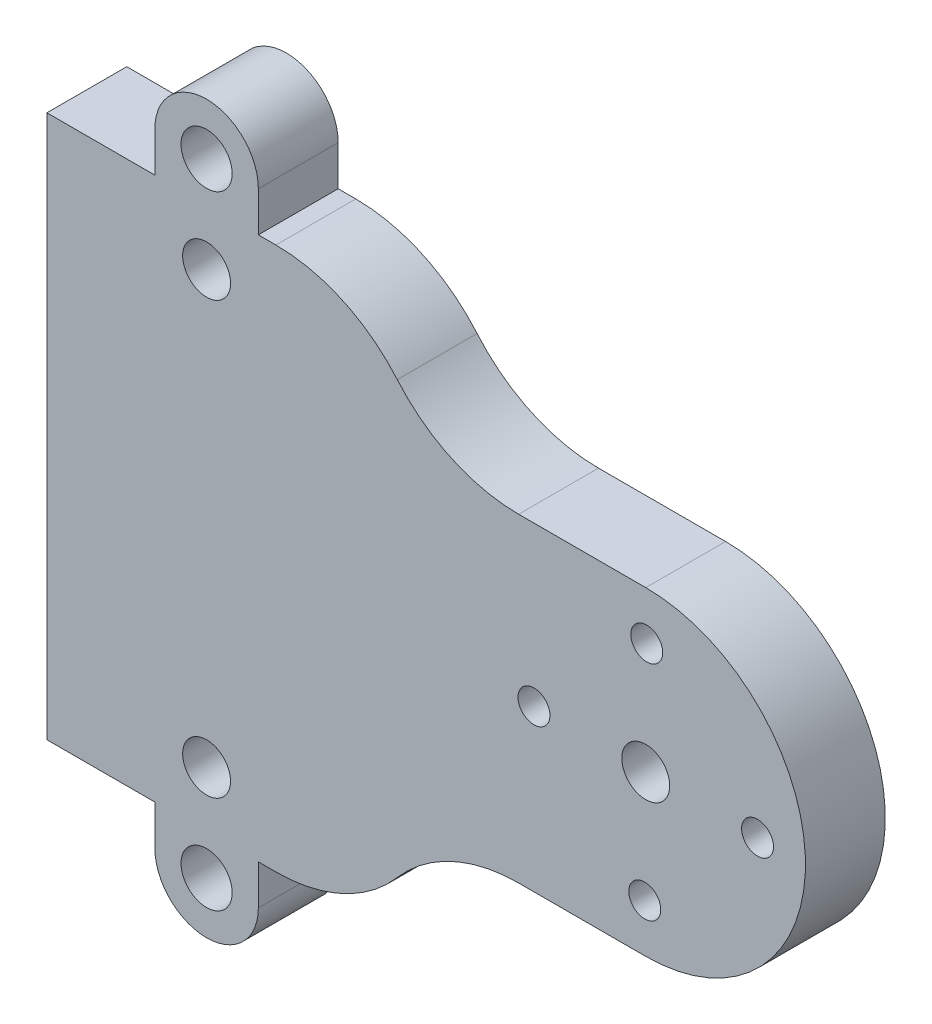
ISO-10303-21;
HEADER;
FILE_DESCRIPTION(('STEP AP214'),'2;1');
FILE_NAME('part.step','',(''),(''),'','','');
FILE_SCHEMA(('AUTOMOTIVE_DESIGN { 1 0 10303 214 1 1 1 1 }'));
ENDSEC;
DATA;
#1=APPLICATION_CONTEXT('core data for automotive mechanical design processes');
#2=APPLICATION_PROTOCOL_DEFINITION('international standard','automotive_design',2000,#1);
#3=PRODUCT_CONTEXT('',#1,'mechanical');
#4=PRODUCT('Part','Part','',(#3));
#5=PRODUCT_RELATED_PRODUCT_CATEGORY('part','',(#4));
#6=PRODUCT_DEFINITION_FORMATION('','',#4);
#7=PRODUCT_DEFINITION_CONTEXT('part definition',#1,'design');
#8=PRODUCT_DEFINITION('design','',#6,#7);
#9=PRODUCT_DEFINITION_SHAPE('','',#8);
#10=(LENGTH_UNIT() NAMED_UNIT(*) SI_UNIT(.MILLI.,.METRE.));
#11=(NAMED_UNIT(*) PLANE_ANGLE_UNIT() SI_UNIT($,.RADIAN.));
#12=(NAMED_UNIT(*) SI_UNIT($,.STERADIAN.) SOLID_ANGLE_UNIT());
#13=UNCERTAINTY_MEASURE_WITH_UNIT(LENGTH_MEASURE(1.E-05),#10,'distance_accuracy_value','');
#14=(GEOMETRIC_REPRESENTATION_CONTEXT(3) GLOBAL_UNCERTAINTY_ASSIGNED_CONTEXT((#13)) GLOBAL_UNIT_ASSIGNED_CONTEXT((#10,
#11,#12)) REPRESENTATION_CONTEXT('',''));
#15=CARTESIAN_POINT('',(0.,0.,0.));
#16=DIRECTION('',(0.,0.,1.));
#17=DIRECTION('',(1.,0.,0.));
#18=AXIS2_PLACEMENT_3D('',#15,#16,#17);
#19=CARTESIAN_POINT('',(-21.5845968576232,7.70287081339713,5.));
#20=DIRECTION('',(0.,-1.,0.));
#21=DIRECTION('',(1.,0.,0.));
#22=AXIS2_PLACEMENT_3D('',#19,#20,#21);
#23=PLANE('',#22);
#24=DIRECTION('',(-1.,0.,0.));
#25=VECTOR('',#24,1.);
#26=CARTESIAN_POINT('',(-21.5845968576232,7.70287081339713,5.));
#27=LINE('',#26,#25);
#28=CARTESIAN_POINT('',(-12.3245968576232,7.70287081339713,5.));
#29=VERTEX_POINT('',#28);
#30=CARTESIAN_POINT('',(-19.0845968576232,7.70287081339713,5.));
#31=VERTEX_POINT('',#30);
#32=EDGE_CURVE('E258',#29,#31,#27,.T.);
#33=ORIENTED_EDGE('',*,*,#32,.F.);
#34=DIRECTION('',(0.,0.,-1.));
#35=VECTOR('',#34,1.);
#36=CARTESIAN_POINT('',(-12.3245968576232,7.70287081339713,5.));
#37=LINE('',#36,#35);
#38=CARTESIAN_POINT('',(-12.3245968576232,7.70287081339713,0.));
#39=VERTEX_POINT('',#38);
#40=EDGE_CURVE('E315',#29,#39,#37,.T.);
#41=ORIENTED_EDGE('',*,*,#40,.T.);
#42=DIRECTION('',(-1.,0.,0.));
#43=VECTOR('',#42,1.);
#44=CARTESIAN_POINT('',(-21.5845968576232,7.70287081339713,0.));
#45=LINE('',#44,#43);
#46=CARTESIAN_POINT('',(-19.0845968576232,7.70287081339713,0.));
#47=VERTEX_POINT('',#46);
#48=EDGE_CURVE('E263',#39,#47,#45,.T.);
#49=ORIENTED_EDGE('',*,*,#48,.T.);
#50=DIRECTION('',(0.,0.,1.));
#51=VECTOR('',#50,1.);
#52=CARTESIAN_POINT('',(-19.0845968576232,7.70287081339713,5.));
#53=LINE('',#52,#51);
#54=EDGE_CURVE('E305',#47,#31,#53,.T.);
#55=ORIENTED_EDGE('',*,*,#54,.T.);
#56=EDGE_LOOP('',(#33,#41,#49,#55));
#57=FACE_BOUND('',#56,.T.);
#58=ADVANCED_FACE('F32',(#57),#23,.F.);
#59=CARTESIAN_POINT('',(-21.5845968576232,-26.2971291866029,5.));
#60=DIRECTION('',(0.,1.,0.));
#61=DIRECTION('',(-1.,0.,0.));
#62=AXIS2_PLACEMENT_3D('',#59,#60,#61);
#63=PLANE('',#62);
#64=DIRECTION('',(1.,0.,0.));
#65=VECTOR('',#64,1.);
#66=CARTESIAN_POINT('',(-21.5845968576232,-26.2971291866029,0.));
#67=LINE('',#66,#65);
#68=CARTESIAN_POINT('',(-5.84459685762318,-26.2971291866029,0.));
#69=VERTEX_POINT('',#68);
#70=CARTESIAN_POINT('',(-4.74388899702438,-26.2971291866029,0.));
#71=VERTEX_POINT('',#70);
#72=EDGE_CURVE('E253',#69,#71,#67,.T.);
#73=ORIENTED_EDGE('',*,*,#72,.T.);
#74=DIRECTION('',(0.,0.,1.));
#75=VECTOR('',#74,1.);
#76=CARTESIAN_POINT('',(-4.74388899702438,-26.2971291866029,5.));
#77=LINE('',#76,#75);
#78=CARTESIAN_POINT('',(-4.74388899702438,-26.2971291866029,5.));
#79=VERTEX_POINT('',#78);
#80=EDGE_CURVE('E340',#71,#79,#77,.T.);
#81=ORIENTED_EDGE('',*,*,#80,.T.);
#82=DIRECTION('',(1.,0.,0.));
#83=VECTOR('',#82,1.);
#84=CARTESIAN_POINT('',(-21.5845968576232,-26.2971291866029,5.));
#85=LINE('',#84,#83);
#86=CARTESIAN_POINT('',(-5.84459685762318,-26.2971291866029,5.));
#87=VERTEX_POINT('',#86);
#88=EDGE_CURVE('E245',#87,#79,#85,.T.);
#89=ORIENTED_EDGE('',*,*,#88,.F.);
#90=DIRECTION('',(0.,0.,-1.));
#91=VECTOR('',#90,1.);
#92=CARTESIAN_POINT('',(-5.84459685762318,-26.2971291866029,5.));
#93=LINE('',#92,#91);
#94=EDGE_CURVE('E310',#87,#69,#93,.T.);
#95=ORIENTED_EDGE('',*,*,#94,.T.);
#96=EDGE_LOOP('',(#73,#81,#89,#95));
#97=FACE_BOUND('',#96,.T.);
#98=ADVANCED_FACE('F365',(#97),#63,.F.);
#99=CARTESIAN_POINT('',(-4.03454117826684,-8.29712918660287,5.));
#100=DIRECTION('',(0.,0.,1.));
#101=DIRECTION('',(1.,0.,0.));
#102=AXIS2_PLACEMENT_3D('',#99,#100,#101);
#103=PLANE('',#102);
#104=ORIENTED_EDGE('',*,*,#88,.T.);
#105=CARTESIAN_POINT('',(-4.74388899702439,-16.2971291866029,5.));
#106=DIRECTION('',(0.,0.,1.));
#107=DIRECTION('',(1.,0.,0.));
#108=AXIS2_PLACEMENT_3D('',#105,#106,#107);
#109=CIRCLE('',#108,10.);
#110=CARTESIAN_POINT('',(2.85545307976094,-22.7971291866029,5.));
#111=VERTEX_POINT('',#110);
#112=EDGE_CURVE('E343',#79,#111,#109,.T.);
#113=ORIENTED_EDGE('',*,*,#112,.T.);
#114=CARTESIAN_POINT('',(10.4547951565463,-29.2971291866029,5.));
#115=DIRECTION('',(0.,0.,1.));
#116=DIRECTION('',(1.,0.,0.));
#117=AXIS2_PLACEMENT_3D('',#114,#115,#116);
#118=CIRCLE('',#117,10.);
#119=CARTESIAN_POINT('',(10.4547951565463,-19.2971291866029,5.));
#120=VERTEX_POINT('',#119);
#121=EDGE_CURVE('E331',#111,#120,#118,.F.);
#122=ORIENTED_EDGE('',*,*,#121,.T.);
#123=DIRECTION('',(1.,0.,0.));
#124=VECTOR('',#123,1.);
#125=CARTESIAN_POINT('',(26.1986671424018,-19.2971291866029,5.));
#126=LINE('',#125,#124);
#127=CARTESIAN_POINT('',(18.4154031423768,-19.2971291866029,5.));
#128=VERTEX_POINT('',#127);
#129=EDGE_CURVE('E243',#120,#128,#126,.T.);
#130=ORIENTED_EDGE('',*,*,#129,.T.);
#131=CARTESIAN_POINT('',(18.4154031423768,-9.29712918660288,5.));
#132=DIRECTION('',(0.,0.,1.));
#133=DIRECTION('',(1.,0.,0.));
#134=AXIS2_PLACEMENT_3D('',#131,#132,#133);
#135=CIRCLE('',#134,10.);
#136=CARTESIAN_POINT('',(18.4154031423768,0.702870813397129,5.));
#137=VERTEX_POINT('',#136);
#138=EDGE_CURVE('E295',#128,#137,#135,.T.);
#139=ORIENTED_EDGE('',*,*,#138,.T.);
#140=DIRECTION('',(-1.,0.,0.));
#141=VECTOR('',#140,1.);
#142=CARTESIAN_POINT('',(26.1986671424018,0.702870813397122,5.));
#143=LINE('',#142,#141);
#144=CARTESIAN_POINT('',(10.4547951565463,0.702870813397121,5.));
#145=VERTEX_POINT('',#144);
#146=EDGE_CURVE('E255',#137,#145,#143,.T.);
#147=ORIENTED_EDGE('',*,*,#146,.T.);
#148=CARTESIAN_POINT('',(10.4547951565463,10.7028708133971,5.));
#149=DIRECTION('',(0.,0.,1.));
#150=DIRECTION('',(1.,0.,0.));
#151=AXIS2_PLACEMENT_3D('',#148,#149,#150);
#152=CIRCLE('',#151,10.);
#153=CARTESIAN_POINT('',(2.85545307976094,4.20287081339712,5.));
#154=VERTEX_POINT('',#153);
#155=EDGE_CURVE('E324',#145,#154,#152,.F.);
#156=ORIENTED_EDGE('',*,*,#155,.T.);
#157=CARTESIAN_POINT('',(-4.7438889970244,-2.29712918660288,5.));
#158=DIRECTION('',(0.,0.,1.));
#159=DIRECTION('',(1.,0.,0.));
#160=AXIS2_PLACEMENT_3D('',#157,#158,#159);
#161=CIRCLE('',#160,10.);
#162=CARTESIAN_POINT('',(-4.7438889970244,7.70287081339712,5.));
#163=VERTEX_POINT('',#162);
#164=EDGE_CURVE('E47',#154,#163,#161,.T.);
#165=ORIENTED_EDGE('',*,*,#164,.T.);
#166=CARTESIAN_POINT('',(-5.84459685762318,7.70287081339713,5.));
#167=VERTEX_POINT('',#166);
#168=EDGE_CURVE('E176',#163,#167,#27,.T.);
#169=ORIENTED_EDGE('',*,*,#168,.T.);
#170=DIRECTION('',(0.,-1.,0.));
#171=VECTOR('',#170,1.);
#172=CARTESIAN_POINT('',(-5.84459685762318,6.75773830821158,5.));
#173=LINE('',#172,#171);
#174=CARTESIAN_POINT('',(-5.84459685762318,10.2028708133971,5.));
#175=VERTEX_POINT('',#174);
#176=EDGE_CURVE('E160',#175,#167,#173,.T.);
#177=ORIENTED_EDGE('',*,*,#176,.F.);
#178=CARTESIAN_POINT('',(-9.08459685762318,10.2028708133971,5.));
#179=DIRECTION('',(0.,0.,-1.));
#180=DIRECTION('',(-1.,0.,0.));
#181=AXIS2_PLACEMENT_3D('',#178,#179,#180);
#182=CIRCLE('',#181,3.24);
#183=CARTESIAN_POINT('',(-12.3245968576232,10.2028708133971,5.));
#184=VERTEX_POINT('',#183);
#185=EDGE_CURVE('E175',#184,#175,#182,.T.);
#186=ORIENTED_EDGE('',*,*,#185,.F.);
#187=DIRECTION('',(0.,1.,0.));
#188=VECTOR('',#187,1.);
#189=CARTESIAN_POINT('',(-12.3245968576232,6.75773830821158,5.));
#190=LINE('',#189,#188);
#191=EDGE_CURVE('E168',#29,#184,#190,.T.);
#192=ORIENTED_EDGE('',*,*,#191,.F.);
#193=ORIENTED_EDGE('',*,*,#32,.T.);
#194=DIRECTION('',(0.,-1.,0.));
#195=VECTOR('',#194,1.);
#196=CARTESIAN_POINT('',(-19.0845968576232,-28.9494172005716,5.));
#197=LINE('',#196,#195);
#198=CARTESIAN_POINT('',(-19.0845968576232,-26.2971291866029,5.));
#199=VERTEX_POINT('',#198);
#200=EDGE_CURVE('E230',#31,#199,#197,.T.);
#201=ORIENTED_EDGE('',*,*,#200,.T.);
#202=CARTESIAN_POINT('',(-12.3245968576232,-26.2971291866029,5.));
#203=VERTEX_POINT('',#202);
#204=EDGE_CURVE('E247',#199,#203,#85,.T.);
#205=ORIENTED_EDGE('',*,*,#204,.T.);
#206=DIRECTION('',(0.,1.,0.));
#207=VECTOR('',#206,1.);
#208=CARTESIAN_POINT('',(-12.3245968576232,-28.7971291866029,5.));
#209=LINE('',#208,#207);
#210=CARTESIAN_POINT('',(-12.3245968576232,-28.7971291866029,5.));
#211=VERTEX_POINT('',#210);
#212=EDGE_CURVE('E205',#211,#203,#209,.T.);
#213=ORIENTED_EDGE('',*,*,#212,.F.);
#214=CARTESIAN_POINT('',(-9.08459685762318,-28.7971291866029,5.));
#215=DIRECTION('',(0.,0.,-1.));
#216=DIRECTION('',(-1.,0.,0.));
#217=AXIS2_PLACEMENT_3D('',#214,#215,#216);
#218=CIRCLE('',#217,3.24);
#219=CARTESIAN_POINT('',(-5.84459685762318,-28.7971291866029,5.));
#220=VERTEX_POINT('',#219);
#221=EDGE_CURVE('E202',#220,#211,#218,.T.);
#222=ORIENTED_EDGE('',*,*,#221,.F.);
#223=DIRECTION('',(0.,-1.,0.));
#224=VECTOR('',#223,1.);
#225=CARTESIAN_POINT('',(-5.84459685762318,-28.7971291866029,5.));
#226=LINE('',#225,#224);
#227=EDGE_CURVE('E209',#87,#220,#226,.T.);
#228=ORIENTED_EDGE('',*,*,#227,.F.);
#229=EDGE_LOOP('',(#104,#113,#122,#130,#139,#147,#156,#165,#169,#177,#186,#192,#193,#201,#205,
#213,#222,#228));
#230=FACE_BOUND('',#229,.T.);
#231=CARTESIAN_POINT('',(11.4154031423768,-9.2346746111763,5.));
#232=DIRECTION('',(0.,0.,1.));
#233=DIRECTION('',(1.,0.,0.));
#234=AXIS2_PLACEMENT_3D('',#231,#232,#233);
#235=CIRCLE('',#234,1.);
#236=CARTESIAN_POINT('',(12.4154031423768,-9.2346746111763,5.));
#237=VERTEX_POINT('',#236);
#238=EDGE_CURVE('E271',#237,#237,#235,.T.);
#239=ORIENTED_EDGE('',*,*,#238,.F.);
#240=EDGE_LOOP('',(#239));
#241=FACE_BOUND('',#240,.T.);
#242=CARTESIAN_POINT('',(25.4154031423768,-9.35958376202946,5.));
#243=DIRECTION('',(0.,0.,1.));
#244=DIRECTION('',(1.,0.,0.));
#245=AXIS2_PLACEMENT_3D('',#242,#243,#244);
#246=CIRCLE('',#245,0.999999999999998);
#247=CARTESIAN_POINT('',(26.4154031423768,-9.35958376202946,5.));
#248=VERTEX_POINT('',#247);
#249=EDGE_CURVE('E283',#248,#248,#246,.T.);
#250=ORIENTED_EDGE('',*,*,#249,.F.);
#251=EDGE_LOOP('',(#250));
#252=FACE_BOUND('',#251,.T.);
#253=CARTESIAN_POINT('',(18.4778577178034,-2.29712918660288,5.));
#254=DIRECTION('',(0.,0.,1.));
#255=DIRECTION('',(1.,0.,0.));
#256=AXIS2_PLACEMENT_3D('',#253,#254,#255);
#257=CIRCLE('',#256,1.);
#258=CARTESIAN_POINT('',(19.4778577178034,-2.29712918660288,5.));
#259=VERTEX_POINT('',#258);
#260=EDGE_CURVE('E289',#259,#259,#257,.T.);
#261=ORIENTED_EDGE('',*,*,#260,.F.);
#262=EDGE_LOOP('',(#261));
#263=FACE_BOUND('',#262,.T.);
#264=CARTESIAN_POINT('',(18.4154031423768,-9.29712918660288,5.));
#265=DIRECTION('',(0.,0.,1.));
#266=DIRECTION('',(1.,0.,0.));
#267=AXIS2_PLACEMENT_3D('',#264,#265,#266);
#268=CIRCLE('',#267,1.5);
#269=CARTESIAN_POINT('',(19.9154031423768,-9.29712918660288,5.));
#270=VERTEX_POINT('',#269);
#271=EDGE_CURVE('E277',#270,#270,#268,.T.);
#272=ORIENTED_EDGE('',*,*,#271,.F.);
#273=EDGE_LOOP('',(#272));
#274=FACE_BOUND('',#273,.T.);
#275=CARTESIAN_POINT('',(18.3529485669502,-16.2971291866029,5.));
#276=DIRECTION('',(0.,0.,1.));
#277=DIRECTION('',(1.,0.,0.));
#278=AXIS2_PLACEMENT_3D('',#275,#276,#277);
#279=CIRCLE('',#278,0.999999999999998);
#280=CARTESIAN_POINT('',(19.3529485669502,-16.2971291866029,5.));
#281=VERTEX_POINT('',#280);
#282=EDGE_CURVE('E265',#281,#281,#279,.T.);
#283=ORIENTED_EDGE('',*,*,#282,.F.);
#284=EDGE_LOOP('',(#283));
#285=FACE_BOUND('',#284,.T.);
#286=CARTESIAN_POINT('',(-9.08459685762318,-22.7971291866029,5.));
#287=DIRECTION('',(0.,0.,-1.));
#288=DIRECTION('',(-1.,0.,0.));
#289=AXIS2_PLACEMENT_3D('',#286,#287,#288);
#290=CIRCLE('',#289,1.5);
#291=CARTESIAN_POINT('',(-10.5845968576232,-22.7971291866029,5.));
#292=VERTEX_POINT('',#291);
#293=EDGE_CURVE('E234',#292,#292,#290,.T.);
#294=ORIENTED_EDGE('',*,*,#293,.T.);
#295=EDGE_LOOP('',(#294));
#296=FACE_BOUND('',#295,.T.);
#297=CARTESIAN_POINT('',(-9.08459685762318,4.20287081339712,5.));
#298=DIRECTION('',(0.,0.,-1.));
#299=DIRECTION('',(-1.,0.,0.));
#300=AXIS2_PLACEMENT_3D('',#297,#298,#299);
#301=CIRCLE('',#300,1.5);
#302=CARTESIAN_POINT('',(-10.5845968576232,4.20287081339712,5.));
#303=VERTEX_POINT('',#302);
#304=EDGE_CURVE('E223',#303,#303,#301,.T.);
#305=ORIENTED_EDGE('',*,*,#304,.T.);
#306=EDGE_LOOP('',(#305));
#307=FACE_BOUND('',#306,.T.);
#308=CARTESIAN_POINT('',(-9.08459685762318,-28.7971291866029,5.));
#309=DIRECTION('',(0.,0.,-1.));
#310=DIRECTION('',(-1.,0.,0.));
#311=AXIS2_PLACEMENT_3D('',#308,#309,#310);
#312=CIRCLE('',#311,1.6);
#313=CARTESIAN_POINT('',(-10.6845968576232,-28.7971291866029,5.));
#314=VERTEX_POINT('',#313);
#315=EDGE_CURVE('E196',#314,#314,#312,.T.);
#316=ORIENTED_EDGE('',*,*,#315,.T.);
#317=EDGE_LOOP('',(#316));
#318=FACE_BOUND('',#317,.T.);
#319=CARTESIAN_POINT('',(-9.08459685762318,10.2028708133971,5.));
#320=DIRECTION('',(0.,0.,-1.));
#321=DIRECTION('',(-1.,0.,0.));
#322=AXIS2_PLACEMENT_3D('',#319,#320,#321);
#323=CIRCLE('',#322,1.6);
#324=CARTESIAN_POINT('',(-10.6845968576232,10.2028708133971,5.));
#325=VERTEX_POINT('',#324);
#326=EDGE_CURVE('E192',#325,#325,#323,.T.);
#327=ORIENTED_EDGE('',*,*,#326,.T.);
#328=EDGE_LOOP('',(#327));
#329=FACE_BOUND('',#328,.T.);
#330=ADVANCED_FACE('F172',(#230,#241,#252,#263,#274,#285,#296,#307,#318,#329),#103,.T.);
#331=CARTESIAN_POINT('',(-4.03454117826684,-8.29712918660287,0.));
#332=DIRECTION('',(0.,0.,1.));
#333=DIRECTION('',(1.,0.,0.));
#334=AXIS2_PLACEMENT_3D('',#331,#332,#333);
#335=PLANE('',#334);
#336=CARTESIAN_POINT('',(10.4547951565463,-29.2971291866029,0.));
#337=DIRECTION('',(0.,0.,1.));
#338=DIRECTION('',(1.,0.,0.));
#339=AXIS2_PLACEMENT_3D('',#336,#337,#338);
#340=CIRCLE('',#339,10.);
#341=CARTESIAN_POINT('',(10.4547951565463,-19.2971291866029,0.));
#342=VERTEX_POINT('',#341);
#343=CARTESIAN_POINT('',(2.85545307976094,-22.7971291866029,0.));
#344=VERTEX_POINT('',#343);
#345=EDGE_CURVE('E328',#342,#344,#340,.T.);
#346=ORIENTED_EDGE('',*,*,#345,.T.);
#347=CARTESIAN_POINT('',(-4.74388899702439,-16.2971291866029,0.));
#348=DIRECTION('',(0.,0.,1.));
#349=DIRECTION('',(1.,0.,0.));
#350=AXIS2_PLACEMENT_3D('',#347,#348,#349);
#351=CIRCLE('',#350,10.);
#352=EDGE_CURVE('E338',#344,#71,#351,.F.);
#353=ORIENTED_EDGE('',*,*,#352,.T.);
#354=ORIENTED_EDGE('',*,*,#72,.F.);
#355=DIRECTION('',(0.,-1.,0.));
#356=VECTOR('',#355,1.);
#357=CARTESIAN_POINT('',(-5.84459685762318,-28.7971291866029,0.));
#358=LINE('',#357,#356);
#359=CARTESIAN_POINT('',(-5.84459685762318,-28.7971291866029,0.));
#360=VERTEX_POINT('',#359);
#361=EDGE_CURVE('E206',#69,#360,#358,.T.);
#362=ORIENTED_EDGE('',*,*,#361,.T.);
#363=CARTESIAN_POINT('',(-9.08459685762318,-28.7971291866029,0.));
#364=DIRECTION('',(0.,0.,-1.));
#365=DIRECTION('',(-1.,0.,0.));
#366=AXIS2_PLACEMENT_3D('',#363,#364,#365);
#367=CIRCLE('',#366,3.24);
#368=CARTESIAN_POINT('',(-12.3245968576232,-28.7971291866029,0.));
#369=VERTEX_POINT('',#368);
#370=EDGE_CURVE('E199',#360,#369,#367,.T.);
#371=ORIENTED_EDGE('',*,*,#370,.T.);
#372=DIRECTION('',(0.,1.,0.));
#373=VECTOR('',#372,1.);
#374=CARTESIAN_POINT('',(-12.3245968576232,-28.7971291866029,0.));
#375=LINE('',#374,#373);
#376=CARTESIAN_POINT('',(-12.3245968576232,-26.2971291866029,0.));
#377=VERTEX_POINT('',#376);
#378=EDGE_CURVE('E214',#369,#377,#375,.T.);
#379=ORIENTED_EDGE('',*,*,#378,.T.);
#380=CARTESIAN_POINT('',(-19.0845968576232,-26.2971291866029,0.));
#381=VERTEX_POINT('',#380);
#382=EDGE_CURVE('E246',#381,#377,#67,.T.);
#383=ORIENTED_EDGE('',*,*,#382,.F.);
#384=DIRECTION('',(0.,-1.,0.));
#385=VECTOR('',#384,1.);
#386=CARTESIAN_POINT('',(-19.0845968576232,-28.9494172005716,0.));
#387=LINE('',#386,#385);
#388=EDGE_CURVE('E221',#47,#381,#387,.T.);
#389=ORIENTED_EDGE('',*,*,#388,.F.);
#390=ORIENTED_EDGE('',*,*,#48,.F.);
#391=DIRECTION('',(0.,1.,0.));
#392=VECTOR('',#391,1.);
#393=CARTESIAN_POINT('',(-12.3245968576232,6.75773830821158,0.));
#394=LINE('',#393,#392);
#395=CARTESIAN_POINT('',(-12.3245968576232,10.2028708133971,0.));
#396=VERTEX_POINT('',#395);
#397=EDGE_CURVE('E182',#39,#396,#394,.T.);
#398=ORIENTED_EDGE('',*,*,#397,.T.);
#399=CARTESIAN_POINT('',(-9.08459685762318,10.2028708133971,0.));
#400=DIRECTION('',(0.,0.,-1.));
#401=DIRECTION('',(-1.,0.,0.));
#402=AXIS2_PLACEMENT_3D('',#399,#400,#401);
#403=CIRCLE('',#402,3.24);
#404=CARTESIAN_POINT('',(-5.84459685762318,10.2028708133971,0.));
#405=VERTEX_POINT('',#404);
#406=EDGE_CURVE('E190',#396,#405,#403,.T.);
#407=ORIENTED_EDGE('',*,*,#406,.T.);
#408=DIRECTION('',(0.,-1.,0.));
#409=VECTOR('',#408,1.);
#410=CARTESIAN_POINT('',(-5.84459685762318,6.75773830821158,0.));
#411=LINE('',#410,#409);
#412=CARTESIAN_POINT('',(-5.84459685762318,7.70287081339713,0.));
#413=VERTEX_POINT('',#412);
#414=EDGE_CURVE('E162',#405,#413,#411,.T.);
#415=ORIENTED_EDGE('',*,*,#414,.T.);
#416=CARTESIAN_POINT('',(-4.7438889970244,7.70287081339712,0.));
#417=VERTEX_POINT('',#416);
#418=EDGE_CURVE('E259',#417,#413,#45,.T.);
#419=ORIENTED_EDGE('',*,*,#418,.F.);
#420=CARTESIAN_POINT('',(-4.7438889970244,-2.29712918660288,0.));
#421=DIRECTION('',(0.,0.,1.));
#422=DIRECTION('',(1.,0.,0.));
#423=AXIS2_PLACEMENT_3D('',#420,#421,#422);
#424=CIRCLE('',#423,10.);
#425=CARTESIAN_POINT('',(2.85545307976094,4.20287081339712,0.));
#426=VERTEX_POINT('',#425);
#427=EDGE_CURVE('E336',#417,#426,#424,.F.);
#428=ORIENTED_EDGE('',*,*,#427,.T.);
#429=CARTESIAN_POINT('',(10.4547951565463,10.7028708133971,0.));
#430=DIRECTION('',(0.,0.,1.));
#431=DIRECTION('',(1.,0.,0.));
#432=AXIS2_PLACEMENT_3D('',#429,#430,#431);
#433=CIRCLE('',#432,10.);
#434=CARTESIAN_POINT('',(10.4547951565463,0.702870813397121,0.));
#435=VERTEX_POINT('',#434);
#436=EDGE_CURVE('E326',#426,#435,#433,.T.);
#437=ORIENTED_EDGE('',*,*,#436,.T.);
#438=DIRECTION('',(-1.,0.,0.));
#439=VECTOR('',#438,1.);
#440=CARTESIAN_POINT('',(26.1986671424018,0.702870813397122,0.));
#441=LINE('',#440,#439);
#442=CARTESIAN_POINT('',(18.4154031423768,0.702870813397129,0.));
#443=VERTEX_POINT('',#442);
#444=EDGE_CURVE('E242',#443,#435,#441,.T.);
#445=ORIENTED_EDGE('',*,*,#444,.F.);
#446=CARTESIAN_POINT('',(18.4154031423768,-9.29712918660288,0.));
#447=DIRECTION('',(0.,0.,1.));
#448=DIRECTION('',(1.,0.,0.));
#449=AXIS2_PLACEMENT_3D('',#446,#447,#448);
#450=CIRCLE('',#449,10.);
#451=CARTESIAN_POINT('',(18.4154031423768,-19.2971291866029,0.));
#452=VERTEX_POINT('',#451);
#453=EDGE_CURVE('E292',#452,#443,#450,.T.);
#454=ORIENTED_EDGE('',*,*,#453,.F.);
#455=DIRECTION('',(1.,0.,0.));
#456=VECTOR('',#455,1.);
#457=CARTESIAN_POINT('',(26.1986671424018,-19.2971291866029,0.));
#458=LINE('',#457,#456);
#459=EDGE_CURVE('E251',#342,#452,#458,.T.);
#460=ORIENTED_EDGE('',*,*,#459,.F.);
#461=EDGE_LOOP('',(#346,#353,#354,#362,#371,#379,#383,#389,#390,#398,#407,#415,#419,#428,#437,
#445,#454,#460));
#462=FACE_BOUND('',#461,.T.);
#463=CARTESIAN_POINT('',(18.4778577178034,-2.29712918660288,0.));
#464=DIRECTION('',(0.,0.,1.));
#465=DIRECTION('',(1.,0.,0.));
#466=AXIS2_PLACEMENT_3D('',#463,#464,#465);
#467=CIRCLE('',#466,1.);
#468=CARTESIAN_POINT('',(19.4778577178034,-2.29712918660288,0.));
#469=VERTEX_POINT('',#468);
#470=EDGE_CURVE('E286',#469,#469,#467,.T.);
#471=ORIENTED_EDGE('',*,*,#470,.T.);
#472=EDGE_LOOP('',(#471));
#473=FACE_BOUND('',#472,.T.);
#474=CARTESIAN_POINT('',(25.4154031423768,-9.35958376202946,0.));
#475=DIRECTION('',(0.,0.,1.));
#476=DIRECTION('',(1.,0.,0.));
#477=AXIS2_PLACEMENT_3D('',#474,#475,#476);
#478=CIRCLE('',#477,0.999999999999998);
#479=CARTESIAN_POINT('',(26.4154031423768,-9.35958376202946,0.));
#480=VERTEX_POINT('',#479);
#481=EDGE_CURVE('E280',#480,#480,#478,.T.);
#482=ORIENTED_EDGE('',*,*,#481,.T.);
#483=EDGE_LOOP('',(#482));
#484=FACE_BOUND('',#483,.T.);
#485=CARTESIAN_POINT('',(18.4154031423768,-9.29712918660288,0.));
#486=DIRECTION('',(0.,0.,1.));
#487=DIRECTION('',(1.,0.,0.));
#488=AXIS2_PLACEMENT_3D('',#485,#486,#487);
#489=CIRCLE('',#488,1.5);
#490=CARTESIAN_POINT('',(19.9154031423768,-9.29712918660288,0.));
#491=VERTEX_POINT('',#490);
#492=EDGE_CURVE('E274',#491,#491,#489,.T.);
#493=ORIENTED_EDGE('',*,*,#492,.T.);
#494=EDGE_LOOP('',(#493));
#495=FACE_BOUND('',#494,.T.);
#496=CARTESIAN_POINT('',(11.4154031423768,-9.2346746111763,0.));
#497=DIRECTION('',(0.,0.,1.));
#498=DIRECTION('',(1.,0.,0.));
#499=AXIS2_PLACEMENT_3D('',#496,#497,#498);
#500=CIRCLE('',#499,1.);
#501=CARTESIAN_POINT('',(12.4154031423768,-9.2346746111763,0.));
#502=VERTEX_POINT('',#501);
#503=EDGE_CURVE('E268',#502,#502,#500,.T.);
#504=ORIENTED_EDGE('',*,*,#503,.T.);
#505=EDGE_LOOP('',(#504));
#506=FACE_BOUND('',#505,.T.);
#507=CARTESIAN_POINT('',(18.3529485669502,-16.2971291866029,0.));
#508=DIRECTION('',(0.,0.,1.));
#509=DIRECTION('',(1.,0.,0.));
#510=AXIS2_PLACEMENT_3D('',#507,#508,#509);
#511=CIRCLE('',#510,0.999999999999998);
#512=CARTESIAN_POINT('',(19.3529485669502,-16.2971291866029,0.));
#513=VERTEX_POINT('',#512);
#514=EDGE_CURVE('E250',#513,#513,#511,.T.);
#515=ORIENTED_EDGE('',*,*,#514,.T.);
#516=EDGE_LOOP('',(#515));
#517=FACE_BOUND('',#516,.T.);
#518=CARTESIAN_POINT('',(-9.08459685762318,-22.7971291866029,0.));
#519=DIRECTION('',(0.,0.,-1.));
#520=DIRECTION('',(-1.,0.,0.));
#521=AXIS2_PLACEMENT_3D('',#518,#519,#520);
#522=CIRCLE('',#521,1.5);
#523=CARTESIAN_POINT('',(-10.5845968576232,-22.7971291866029,0.));
#524=VERTEX_POINT('',#523);
#525=EDGE_CURVE('E226',#524,#524,#522,.T.);
#526=ORIENTED_EDGE('',*,*,#525,.F.);
#527=EDGE_LOOP('',(#526));
#528=FACE_BOUND('',#527,.T.);
#529=CARTESIAN_POINT('',(-9.08459685762318,4.20287081339712,0.));
#530=DIRECTION('',(0.,0.,-1.));
#531=DIRECTION('',(-1.,0.,0.));
#532=AXIS2_PLACEMENT_3D('',#529,#530,#531);
#533=CIRCLE('',#532,1.5);
#534=CARTESIAN_POINT('',(-10.5845968576232,4.20287081339712,0.));
#535=VERTEX_POINT('',#534);
#536=EDGE_CURVE('E227',#535,#535,#533,.T.);
#537=ORIENTED_EDGE('',*,*,#536,.F.);
#538=EDGE_LOOP('',(#537));
#539=FACE_BOUND('',#538,.T.);
#540=CARTESIAN_POINT('',(-9.08459685762318,-28.7971291866029,0.));
#541=DIRECTION('',(0.,0.,-1.));
#542=DIRECTION('',(-1.,0.,0.));
#543=AXIS2_PLACEMENT_3D('',#540,#541,#542);
#544=CIRCLE('',#543,1.6);
#545=CARTESIAN_POINT('',(-10.6845968576232,-28.7971291866029,0.));
#546=VERTEX_POINT('',#545);
#547=EDGE_CURVE('E194',#546,#546,#544,.T.);
#548=ORIENTED_EDGE('',*,*,#547,.F.);
#549=EDGE_LOOP('',(#548));
#550=FACE_BOUND('',#549,.T.);
#551=CARTESIAN_POINT('',(-9.08459685762318,10.2028708133971,0.));
#552=DIRECTION('',(0.,0.,-1.));
#553=DIRECTION('',(-1.,0.,0.));
#554=AXIS2_PLACEMENT_3D('',#551,#552,#553);
#555=CIRCLE('',#554,1.6);
#556=CARTESIAN_POINT('',(-10.6845968576232,10.2028708133971,0.));
#557=VERTEX_POINT('',#556);
#558=EDGE_CURVE('E186',#557,#557,#555,.T.);
#559=ORIENTED_EDGE('',*,*,#558,.F.);
#560=EDGE_LOOP('',(#559));
#561=FACE_BOUND('',#560,.T.);
#562=ADVANCED_FACE('F351',(#462,#473,#484,#495,#506,#517,#528,#539,#550,#561),#335,.F.);
#563=CARTESIAN_POINT('',(18.4154031423768,-9.29712918660288,5.));
#564=DIRECTION('',(0.,0.,-1.));
#565=DIRECTION('',(-1.,0.,0.));
#566=AXIS2_PLACEMENT_3D('',#563,#564,#565);
#567=CYLINDRICAL_SURFACE('',#566,10.);
#568=ORIENTED_EDGE('',*,*,#453,.T.);
#569=DIRECTION('',(0.,0.,-1.));
#570=VECTOR('',#569,1.);
#571=CARTESIAN_POINT('',(18.4154031423768,0.702870813397122,5.));
#572=LINE('',#571,#570);
#573=EDGE_CURVE('E298',#137,#443,#572,.T.);
#574=ORIENTED_EDGE('',*,*,#573,.F.);
#575=ORIENTED_EDGE('',*,*,#138,.F.);
#576=DIRECTION('',(0.,0.,-1.));
#577=VECTOR('',#576,1.);
#578=CARTESIAN_POINT('',(18.4154031423768,-19.2971291866029,5.));
#579=LINE('',#578,#577);
#580=EDGE_CURVE('E302',#128,#452,#579,.T.);
#581=ORIENTED_EDGE('',*,*,#580,.T.);
#582=EDGE_LOOP('',(#568,#574,#575,#581));
#583=FACE_BOUND('',#582,.T.);
#584=ADVANCED_FACE('F412',(#583),#567,.T.);
#585=CARTESIAN_POINT('',(18.4778577178034,-2.29712918660288,5.));
#586=DIRECTION('',(0.,0.,-1.));
#587=DIRECTION('',(-1.,0.,0.));
#588=AXIS2_PLACEMENT_3D('',#585,#586,#587);
#589=CYLINDRICAL_SURFACE('',#588,1.);
#590=ORIENTED_EDGE('',*,*,#260,.T.);
#591=EDGE_LOOP('',(#590));
#592=FACE_BOUND('',#591,.T.);
#593=ORIENTED_EDGE('',*,*,#470,.F.);
#594=EDGE_LOOP('',(#593));
#595=FACE_BOUND('',#594,.T.);
#596=ADVANCED_FACE('F433',(#592,#595),#589,.F.);
#597=CARTESIAN_POINT('',(25.4154031423768,-9.35958376202946,5.));
#598=DIRECTION('',(0.,0.,-1.));
#599=DIRECTION('',(-1.,0.,0.));
#600=AXIS2_PLACEMENT_3D('',#597,#598,#599);
#601=CYLINDRICAL_SURFACE('',#600,0.999999999999998);
#602=ORIENTED_EDGE('',*,*,#249,.T.);
#603=EDGE_LOOP('',(#602));
#604=FACE_BOUND('',#603,.T.);
#605=ORIENTED_EDGE('',*,*,#481,.F.);
#606=EDGE_LOOP('',(#605));
#607=FACE_BOUND('',#606,.T.);
#608=ADVANCED_FACE('F440',(#604,#607),#601,.F.);
#609=CARTESIAN_POINT('',(18.4154031423768,-9.29712918660288,5.));
#610=DIRECTION('',(0.,0.,-1.));
#611=DIRECTION('',(-1.,0.,0.));
#612=AXIS2_PLACEMENT_3D('',#609,#610,#611);
#613=CYLINDRICAL_SURFACE('',#612,1.5);
#614=ORIENTED_EDGE('',*,*,#271,.T.);
#615=EDGE_LOOP('',(#614));
#616=FACE_BOUND('',#615,.T.);
#617=ORIENTED_EDGE('',*,*,#492,.F.);
#618=EDGE_LOOP('',(#617));
#619=FACE_BOUND('',#618,.T.);
#620=ADVANCED_FACE('F444',(#616,#619),#613,.F.);
#621=CARTESIAN_POINT('',(11.4154031423768,-9.2346746111763,5.));
#622=DIRECTION('',(0.,0.,-1.));
#623=DIRECTION('',(-1.,0.,0.));
#624=AXIS2_PLACEMENT_3D('',#621,#622,#623);
#625=CYLINDRICAL_SURFACE('',#624,1.);
#626=ORIENTED_EDGE('',*,*,#238,.T.);
#627=EDGE_LOOP('',(#626));
#628=FACE_BOUND('',#627,.T.);
#629=ORIENTED_EDGE('',*,*,#503,.F.);
#630=EDGE_LOOP('',(#629));
#631=FACE_BOUND('',#630,.T.);
#632=ADVANCED_FACE('F388',(#628,#631),#625,.F.);
#633=CARTESIAN_POINT('',(18.3529485669502,-16.2971291866029,5.));
#634=DIRECTION('',(0.,0.,-1.));
#635=DIRECTION('',(-1.,0.,0.));
#636=AXIS2_PLACEMENT_3D('',#633,#634,#635);
#637=CYLINDRICAL_SURFACE('',#636,0.999999999999998);
#638=ORIENTED_EDGE('',*,*,#282,.T.);
#639=EDGE_LOOP('',(#638));
#640=FACE_BOUND('',#639,.T.);
#641=ORIENTED_EDGE('',*,*,#514,.F.);
#642=EDGE_LOOP('',(#641));
#643=FACE_BOUND('',#642,.T.);
#644=ADVANCED_FACE('F383',(#640,#643),#637,.F.);
#645=ORIENTED_EDGE('',*,*,#382,.T.);
#646=DIRECTION('',(0.,0.,1.));
#647=VECTOR('',#646,1.);
#648=CARTESIAN_POINT('',(-12.3245968576232,-26.2971291866029,5.));
#649=LINE('',#648,#647);
#650=EDGE_CURVE('E308',#377,#203,#649,.T.);
#651=ORIENTED_EDGE('',*,*,#650,.T.);
#652=ORIENTED_EDGE('',*,*,#204,.F.);
#653=DIRECTION('',(0.,0.,-1.));
#654=VECTOR('',#653,1.);
#655=CARTESIAN_POINT('',(-19.0845968576232,-26.2971291866029,5.));
#656=LINE('',#655,#654);
#657=EDGE_CURVE('E237',#199,#381,#656,.T.);
#658=ORIENTED_EDGE('',*,*,#657,.T.);
#659=EDGE_LOOP('',(#645,#651,#652,#658));
#660=FACE_BOUND('',#659,.T.);
#661=ADVANCED_FACE('F372',(#660),#63,.F.);
#662=ORIENTED_EDGE('',*,*,#168,.F.);
#663=DIRECTION('',(0.,0.,-1.));
#664=VECTOR('',#663,1.);
#665=CARTESIAN_POINT('',(-4.7438889970244,7.70287081339712,5.));
#666=LINE('',#665,#664);
#667=EDGE_CURVE('E40',#163,#417,#666,.T.);
#668=ORIENTED_EDGE('',*,*,#667,.T.);
#669=ORIENTED_EDGE('',*,*,#418,.T.);
#670=DIRECTION('',(0.,0.,1.));
#671=VECTOR('',#670,1.);
#672=CARTESIAN_POINT('',(-5.84459685762318,7.70287081339713,5.));
#673=LINE('',#672,#671);
#674=EDGE_CURVE('E313',#413,#167,#673,.T.);
#675=ORIENTED_EDGE('',*,*,#674,.T.);
#676=EDGE_LOOP('',(#662,#668,#669,#675));
#677=FACE_BOUND('',#676,.T.);
#678=ADVANCED_FACE('F348',(#677),#23,.F.);
#679=CARTESIAN_POINT('',(26.1986671424018,0.702870813397122,5.));
#680=DIRECTION('',(0.,-1.,0.));
#681=DIRECTION('',(1.,0.,0.));
#682=AXIS2_PLACEMENT_3D('',#679,#680,#681);
#683=PLANE('',#682);
#684=ORIENTED_EDGE('',*,*,#444,.T.);
#685=DIRECTION('',(0.,0.,-1.));
#686=VECTOR('',#685,1.);
#687=CARTESIAN_POINT('',(10.4547951565463,0.702870813397121,5.));
#688=LINE('',#687,#686);
#689=EDGE_CURVE('E318',#435,#145,#688,.F.);
#690=ORIENTED_EDGE('',*,*,#689,.T.);
#691=ORIENTED_EDGE('',*,*,#146,.F.);
#692=ORIENTED_EDGE('',*,*,#573,.T.);
#693=EDGE_LOOP('',(#684,#690,#691,#692));
#694=FACE_BOUND('',#693,.T.);
#695=ADVANCED_FACE('F376',(#694),#683,.F.);
#696=CARTESIAN_POINT('',(26.1986671424018,-19.2971291866029,5.));
#697=DIRECTION('',(0.,1.,0.));
#698=DIRECTION('',(0.,0.,1.));
#699=AXIS2_PLACEMENT_3D('',#696,#697,#698);
#700=PLANE('',#699);
#701=ORIENTED_EDGE('',*,*,#129,.F.);
#702=DIRECTION('',(0.,0.,1.));
#703=VECTOR('',#702,1.);
#704=CARTESIAN_POINT('',(10.4547951565463,-19.2971291866029,5.));
#705=LINE('',#704,#703);
#706=EDGE_CURVE('E321',#120,#342,#705,.F.);
#707=ORIENTED_EDGE('',*,*,#706,.T.);
#708=ORIENTED_EDGE('',*,*,#459,.T.);
#709=ORIENTED_EDGE('',*,*,#580,.F.);
#710=EDGE_LOOP('',(#701,#707,#708,#709));
#711=FACE_BOUND('',#710,.T.);
#712=ADVANCED_FACE('F381',(#711),#700,.F.);
#713=CARTESIAN_POINT('',(-19.0845968576232,-28.9494172005716,5.));
#714=DIRECTION('',(1.,0.,0.));
#715=DIRECTION('',(0.,0.,-1.));
#716=AXIS2_PLACEMENT_3D('',#713,#714,#715);
#717=PLANE('',#716);
#718=ORIENTED_EDGE('',*,*,#200,.F.);
#719=ORIENTED_EDGE('',*,*,#54,.F.);
#720=ORIENTED_EDGE('',*,*,#388,.T.);
#721=ORIENTED_EDGE('',*,*,#657,.F.);
#722=EDGE_LOOP('',(#718,#719,#720,#721));
#723=FACE_BOUND('',#722,.T.);
#724=ADVANCED_FACE('F363',(#723),#717,.F.);
#725=CARTESIAN_POINT('',(-9.08459685762318,-22.7971291866029,5.));
#726=DIRECTION('',(0.,0.,-1.));
#727=DIRECTION('',(-1.,0.,0.));
#728=AXIS2_PLACEMENT_3D('',#725,#726,#727);
#729=CYLINDRICAL_SURFACE('',#728,1.5);
#730=ORIENTED_EDGE('',*,*,#293,.F.);
#731=EDGE_LOOP('',(#730));
#732=FACE_BOUND('',#731,.T.);
#733=ORIENTED_EDGE('',*,*,#525,.T.);
#734=EDGE_LOOP('',(#733));
#735=FACE_BOUND('',#734,.T.);
#736=ADVANCED_FACE('F392',(#732,#735),#729,.F.);
#737=CARTESIAN_POINT('',(-9.08459685762318,4.20287081339712,5.));
#738=DIRECTION('',(0.,0.,-1.));
#739=DIRECTION('',(-1.,0.,0.));
#740=AXIS2_PLACEMENT_3D('',#737,#738,#739);
#741=CYLINDRICAL_SURFACE('',#740,1.5);
#742=ORIENTED_EDGE('',*,*,#304,.F.);
#743=EDGE_LOOP('',(#742));
#744=FACE_BOUND('',#743,.T.);
#745=ORIENTED_EDGE('',*,*,#536,.T.);
#746=EDGE_LOOP('',(#745));
#747=FACE_BOUND('',#746,.T.);
#748=ADVANCED_FACE('F493',(#744,#747),#741,.F.);
#749=CARTESIAN_POINT('',(-5.84459685762318,-28.7971291866029,5.));
#750=DIRECTION('',(1.,0.,0.));
#751=DIRECTION('',(0.,0.,-1.));
#752=AXIS2_PLACEMENT_3D('',#749,#750,#751);
#753=PLANE('',#752);
#754=ORIENTED_EDGE('',*,*,#94,.F.);
#755=ORIENTED_EDGE('',*,*,#227,.T.);
#756=DIRECTION('',(0.,0.,-1.));
#757=VECTOR('',#756,1.);
#758=CARTESIAN_POINT('',(-5.84459685762318,-28.7971291866029,5.));
#759=LINE('',#758,#757);
#760=EDGE_CURVE('E218',#220,#360,#759,.T.);
#761=ORIENTED_EDGE('',*,*,#760,.T.);
#762=ORIENTED_EDGE('',*,*,#361,.F.);
#763=EDGE_LOOP('',(#754,#755,#761,#762));
#764=FACE_BOUND('',#763,.T.);
#765=ADVANCED_FACE('F489',(#764),#753,.T.);
#766=CARTESIAN_POINT('',(-12.3245968576232,-28.7971291866029,5.));
#767=DIRECTION('',(-1.,0.,0.));
#768=DIRECTION('',(0.,0.,1.));
#769=AXIS2_PLACEMENT_3D('',#766,#767,#768);
#770=PLANE('',#769);
#771=ORIENTED_EDGE('',*,*,#650,.F.);
#772=ORIENTED_EDGE('',*,*,#378,.F.);
#773=DIRECTION('',(0.,0.,-1.));
#774=VECTOR('',#773,1.);
#775=CARTESIAN_POINT('',(-12.3245968576232,-28.7971291866029,5.));
#776=LINE('',#775,#774);
#777=EDGE_CURVE('E211',#211,#369,#776,.T.);
#778=ORIENTED_EDGE('',*,*,#777,.F.);
#779=ORIENTED_EDGE('',*,*,#212,.T.);
#780=EDGE_LOOP('',(#771,#772,#778,#779));
#781=FACE_BOUND('',#780,.T.);
#782=ADVANCED_FACE('F492',(#781),#770,.T.);
#783=CARTESIAN_POINT('',(-9.08459685762318,-28.7971291866029,5.));
#784=DIRECTION('',(0.,0.,-1.));
#785=DIRECTION('',(-1.,0.,0.));
#786=AXIS2_PLACEMENT_3D('',#783,#784,#785);
#787=CYLINDRICAL_SURFACE('',#786,3.24);
#788=ORIENTED_EDGE('',*,*,#370,.F.);
#789=ORIENTED_EDGE('',*,*,#760,.F.);
#790=ORIENTED_EDGE('',*,*,#221,.T.);
#791=ORIENTED_EDGE('',*,*,#777,.T.);
#792=EDGE_LOOP('',(#788,#789,#790,#791));
#793=FACE_BOUND('',#792,.T.);
#794=ADVANCED_FACE('F487',(#793),#787,.T.);
#795=CARTESIAN_POINT('',(-9.08459685762318,-28.7971291866029,5.));
#796=DIRECTION('',(0.,0.,-1.));
#797=DIRECTION('',(-1.,0.,0.));
#798=AXIS2_PLACEMENT_3D('',#795,#796,#797);
#799=CYLINDRICAL_SURFACE('',#798,1.6);
#800=ORIENTED_EDGE('',*,*,#315,.F.);
#801=EDGE_LOOP('',(#800));
#802=FACE_BOUND('',#801,.T.);
#803=ORIENTED_EDGE('',*,*,#547,.T.);
#804=EDGE_LOOP('',(#803));
#805=FACE_BOUND('',#804,.T.);
#806=ADVANCED_FACE('F482',(#802,#805),#799,.F.);
#807=CARTESIAN_POINT('',(-12.3245968576232,6.75773830821158,5.));
#808=DIRECTION('',(-1.,0.,0.));
#809=DIRECTION('',(0.,0.,1.));
#810=AXIS2_PLACEMENT_3D('',#807,#808,#809);
#811=PLANE('',#810);
#812=ORIENTED_EDGE('',*,*,#40,.F.);
#813=ORIENTED_EDGE('',*,*,#191,.T.);
#814=DIRECTION('',(0.,0.,-1.));
#815=VECTOR('',#814,1.);
#816=CARTESIAN_POINT('',(-12.3245968576232,10.2028708133971,5.));
#817=LINE('',#816,#815);
#818=EDGE_CURVE('E167',#184,#396,#817,.T.);
#819=ORIENTED_EDGE('',*,*,#818,.T.);
#820=ORIENTED_EDGE('',*,*,#397,.F.);
#821=EDGE_LOOP('',(#812,#813,#819,#820));
#822=FACE_BOUND('',#821,.T.);
#823=ADVANCED_FACE('F357',(#822),#811,.T.);
#824=CARTESIAN_POINT('',(-5.84459685762318,6.75773830821158,5.));
#825=DIRECTION('',(1.,0.,0.));
#826=DIRECTION('',(0.,0.,-1.));
#827=AXIS2_PLACEMENT_3D('',#824,#825,#826);
#828=PLANE('',#827);
#829=ORIENTED_EDGE('',*,*,#674,.F.);
#830=ORIENTED_EDGE('',*,*,#414,.F.);
#831=DIRECTION('',(0.,0.,-1.));
#832=VECTOR('',#831,1.);
#833=CARTESIAN_POINT('',(-5.84459685762318,10.2028708133971,5.));
#834=LINE('',#833,#832);
#835=EDGE_CURVE('E156',#175,#405,#834,.T.);
#836=ORIENTED_EDGE('',*,*,#835,.F.);
#837=ORIENTED_EDGE('',*,*,#176,.T.);
#838=EDGE_LOOP('',(#829,#830,#836,#837));
#839=FACE_BOUND('',#838,.T.);
#840=ADVANCED_FACE('F159',(#839),#828,.T.);
#841=CARTESIAN_POINT('',(-9.08459685762318,10.2028708133971,5.));
#842=DIRECTION('',(0.,0.,-1.));
#843=DIRECTION('',(-1.,0.,0.));
#844=AXIS2_PLACEMENT_3D('',#841,#842,#843);
#845=CYLINDRICAL_SURFACE('',#844,3.24);
#846=ORIENTED_EDGE('',*,*,#406,.F.);
#847=ORIENTED_EDGE('',*,*,#818,.F.);
#848=ORIENTED_EDGE('',*,*,#185,.T.);
#849=ORIENTED_EDGE('',*,*,#835,.T.);
#850=EDGE_LOOP('',(#846,#847,#848,#849));
#851=FACE_BOUND('',#850,.T.);
#852=ADVANCED_FACE('F180',(#851),#845,.T.);
#853=CARTESIAN_POINT('',(-9.08459685762318,10.2028708133971,5.));
#854=DIRECTION('',(0.,0.,-1.));
#855=DIRECTION('',(-1.,0.,0.));
#856=AXIS2_PLACEMENT_3D('',#853,#854,#855);
#857=CYLINDRICAL_SURFACE('',#856,1.6);
#858=ORIENTED_EDGE('',*,*,#326,.F.);
#859=EDGE_LOOP('',(#858));
#860=FACE_BOUND('',#859,.T.);
#861=ORIENTED_EDGE('',*,*,#558,.T.);
#862=EDGE_LOOP('',(#861));
#863=FACE_BOUND('',#862,.T.);
#864=ADVANCED_FACE('F430',(#860,#863),#857,.F.);
#865=CARTESIAN_POINT('',(10.4547951565463,10.7028708133971,5.));
#866=DIRECTION('',(0.,0.,-1.));
#867=DIRECTION('',(-1.,0.,0.));
#868=AXIS2_PLACEMENT_3D('',#865,#866,#867);
#869=CYLINDRICAL_SURFACE('',#868,10.);
#870=ORIENTED_EDGE('',*,*,#436,.F.);
#871=DIRECTION('',(0.,0.,-1.));
#872=VECTOR('',#871,1.);
#873=CARTESIAN_POINT('',(2.85545307976094,4.20287081339712,5.));
#874=LINE('',#873,#872);
#875=EDGE_CURVE('E11',#426,#154,#874,.F.);
#876=ORIENTED_EDGE('',*,*,#875,.T.);
#877=ORIENTED_EDGE('',*,*,#155,.F.);
#878=ORIENTED_EDGE('',*,*,#689,.F.);
#879=EDGE_LOOP('',(#870,#876,#877,#878));
#880=FACE_BOUND('',#879,.T.);
#881=ADVANCED_FACE('F415',(#880),#869,.F.);
#882=CARTESIAN_POINT('',(10.4547951565463,-29.2971291866029,5.));
#883=DIRECTION('',(0.,0.,1.));
#884=DIRECTION('',(1.,0.,0.));
#885=AXIS2_PLACEMENT_3D('',#882,#883,#884);
#886=CYLINDRICAL_SURFACE('',#885,10.);
#887=ORIENTED_EDGE('',*,*,#121,.F.);
#888=DIRECTION('',(0.,0.,1.));
#889=VECTOR('',#888,1.);
#890=CARTESIAN_POINT('',(2.85545307976094,-22.7971291866029,5.));
#891=LINE('',#890,#889);
#892=EDGE_CURVE('E333',#111,#344,#891,.F.);
#893=ORIENTED_EDGE('',*,*,#892,.T.);
#894=ORIENTED_EDGE('',*,*,#345,.F.);
#895=ORIENTED_EDGE('',*,*,#706,.F.);
#896=EDGE_LOOP('',(#887,#893,#894,#895));
#897=FACE_BOUND('',#896,.T.);
#898=ADVANCED_FACE('F406',(#897),#886,.F.);
#899=CARTESIAN_POINT('',(-4.74388899702439,-16.2971291866029,5.));
#900=DIRECTION('',(0.,0.,1.));
#901=DIRECTION('',(1.,0.,0.));
#902=AXIS2_PLACEMENT_3D('',#899,#900,#901);
#903=CYLINDRICAL_SURFACE('',#902,10.);
#904=ORIENTED_EDGE('',*,*,#112,.F.);
#905=ORIENTED_EDGE('',*,*,#80,.F.);
#906=ORIENTED_EDGE('',*,*,#352,.F.);
#907=ORIENTED_EDGE('',*,*,#892,.F.);
#908=EDGE_LOOP('',(#904,#905,#906,#907));
#909=FACE_BOUND('',#908,.T.);
#910=ADVANCED_FACE('F417',(#909),#903,.T.);
#911=CARTESIAN_POINT('',(-4.7438889970244,-2.29712918660288,5.));
#912=DIRECTION('',(0.,0.,-1.));
#913=DIRECTION('',(-1.,0.,0.));
#914=AXIS2_PLACEMENT_3D('',#911,#912,#913);
#915=CYLINDRICAL_SURFACE('',#914,10.);
#916=ORIENTED_EDGE('',*,*,#164,.F.);
#917=ORIENTED_EDGE('',*,*,#875,.F.);
#918=ORIENTED_EDGE('',*,*,#427,.F.);
#919=ORIENTED_EDGE('',*,*,#667,.F.);
#920=EDGE_LOOP('',(#916,#917,#918,#919));
#921=FACE_BOUND('',#920,.T.);
#922=ADVANCED_FACE('F34',(#921),#915,.T.);
#923=CLOSED_SHELL('',(#58,#98,#330,#562,#584,#596,#608,#620,#632,#644,#661,#678,#695,#712,#724,
#736,#748,#765,#782,#794,#806,#823,#840,#852,#864,#881,#898,#910,#922));
#924=MANIFOLD_SOLID_BREP('B2',#923);
#925=ADVANCED_BREP_SHAPE_REPRESENTATION('',(#18,#924),#14);
#926=SHAPE_DEFINITION_REPRESENTATION(#9,#925);
ENDSEC;
END-ISO-10303-21;
